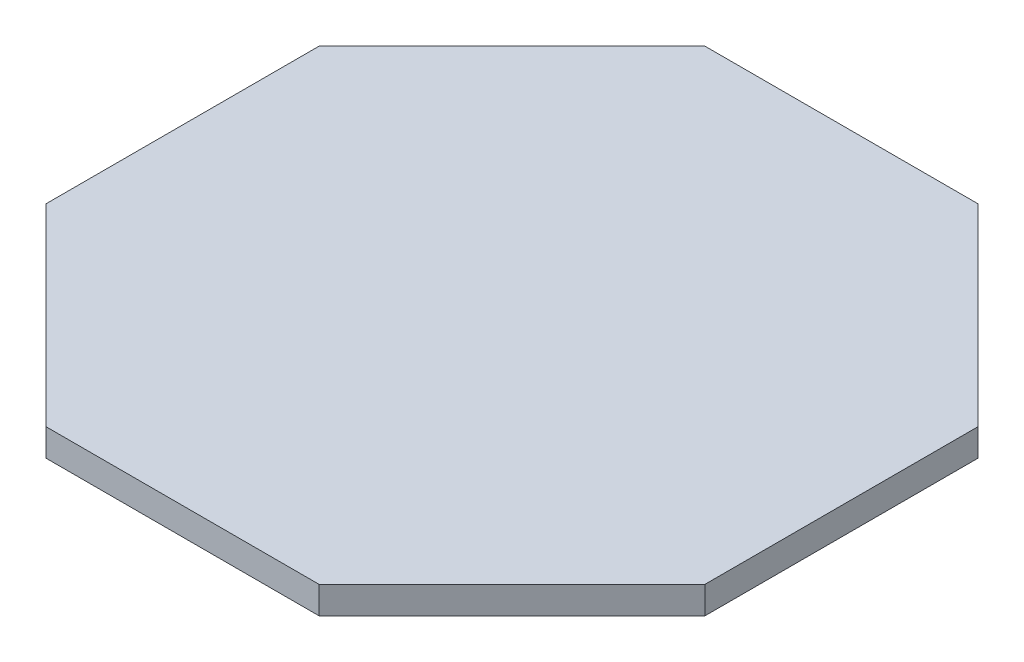
ISO-10303-21;
HEADER;
FILE_DESCRIPTION(('STEP AP214'),'2;1');
FILE_NAME('part.step','',(''),(''),'','','');
FILE_SCHEMA(('AUTOMOTIVE_DESIGN { 1 0 10303 214 1 1 1 1 }'));
ENDSEC;
DATA;
#1=APPLICATION_CONTEXT('core data for automotive mechanical design processes');
#2=APPLICATION_PROTOCOL_DEFINITION('international standard','automotive_design',2000,#1);
#3=PRODUCT_CONTEXT('',#1,'mechanical');
#4=PRODUCT('Part','Part','',(#3));
#5=PRODUCT_RELATED_PRODUCT_CATEGORY('part','',(#4));
#6=PRODUCT_DEFINITION_FORMATION('','',#4);
#7=PRODUCT_DEFINITION_CONTEXT('part definition',#1,'design');
#8=PRODUCT_DEFINITION('design','',#6,#7);
#9=PRODUCT_DEFINITION_SHAPE('','',#8);
#10=(LENGTH_UNIT() NAMED_UNIT(*) SI_UNIT(.MILLI.,.METRE.));
#11=(NAMED_UNIT(*) PLANE_ANGLE_UNIT() SI_UNIT($,.RADIAN.));
#12=(NAMED_UNIT(*) SI_UNIT($,.STERADIAN.) SOLID_ANGLE_UNIT());
#13=UNCERTAINTY_MEASURE_WITH_UNIT(LENGTH_MEASURE(1.E-05),#10,'distance_accuracy_value','');
#14=(GEOMETRIC_REPRESENTATION_CONTEXT(3) GLOBAL_UNCERTAINTY_ASSIGNED_CONTEXT((#13)) GLOBAL_UNIT_ASSIGNED_CONTEXT((#10,
#11,#12)) REPRESENTATION_CONTEXT('',''));
#15=CARTESIAN_POINT('',(0.,0.,0.));
#16=DIRECTION('',(0.,0.,1.));
#17=DIRECTION('',(1.,0.,0.));
#18=AXIS2_PLACEMENT_3D('',#15,#16,#17);
#19=CARTESIAN_POINT('',(24.142135623731,2.,9.99999999999999));
#20=DIRECTION('',(-1.,0.,0.));
#21=DIRECTION('',(0.,0.,1.));
#22=AXIS2_PLACEMENT_3D('',#19,#20,#21);
#23=PLANE('',#22);
#24=DIRECTION('',(0.,0.,-1.));
#25=VECTOR('',#24,1.);
#26=CARTESIAN_POINT('',(24.142135623731,0.,9.99999999999999));
#27=LINE('',#26,#25);
#28=CARTESIAN_POINT('',(24.142135623731,0.,9.99999999999999));
#29=VERTEX_POINT('',#28);
#30=CARTESIAN_POINT('',(24.142135623731,0.,-10.));
#31=VERTEX_POINT('',#30);
#32=EDGE_CURVE('E133',#29,#31,#27,.T.);
#33=ORIENTED_EDGE('',*,*,#32,.T.);
#34=DIRECTION('',(0.,-1.,0.));
#35=VECTOR('',#34,1.);
#36=CARTESIAN_POINT('',(24.142135623731,2.,-10.));
#37=LINE('',#36,#35);
#38=CARTESIAN_POINT('',(24.142135623731,2.,-10.));
#39=VERTEX_POINT('',#38);
#40=EDGE_CURVE('E11',#39,#31,#37,.T.);
#41=ORIENTED_EDGE('',*,*,#40,.F.);
#42=DIRECTION('',(0.,0.,-1.));
#43=VECTOR('',#42,1.);
#44=CARTESIAN_POINT('',(24.142135623731,2.,9.99999999999999));
#45=LINE('',#44,#43);
#46=CARTESIAN_POINT('',(24.142135623731,2.,9.99999999999999));
#47=VERTEX_POINT('',#46);
#48=EDGE_CURVE('E147',#47,#39,#45,.T.);
#49=ORIENTED_EDGE('',*,*,#48,.F.);
#50=DIRECTION('',(0.,-1.,0.));
#51=VECTOR('',#50,1.);
#52=CARTESIAN_POINT('',(24.142135623731,2.,9.99999999999999));
#53=LINE('',#52,#51);
#54=EDGE_CURVE('E129',#47,#29,#53,.T.);
#55=ORIENTED_EDGE('',*,*,#54,.T.);
#56=EDGE_LOOP('',(#33,#41,#49,#55));
#57=FACE_BOUND('',#56,.T.);
#58=ADVANCED_FACE('F37',(#57),#23,.F.);
#59=CARTESIAN_POINT('',(24.142135623731,2.,-10.));
#60=DIRECTION('',(-0.707106781186547,0.,0.707106781186548));
#61=DIRECTION('',(0.707106781186548,0.,0.707106781186547));
#62=AXIS2_PLACEMENT_3D('',#59,#60,#61);
#63=PLANE('',#62);
#64=DIRECTION('',(-0.707106781186548,0.,-0.707106781186547));
#65=VECTOR('',#64,1.);
#66=CARTESIAN_POINT('',(24.142135623731,0.,-10.));
#67=LINE('',#66,#65);
#68=CARTESIAN_POINT('',(10.,0.,-24.1421356237309));
#69=VERTEX_POINT('',#68);
#70=EDGE_CURVE('E136',#31,#69,#67,.T.);
#71=ORIENTED_EDGE('',*,*,#70,.T.);
#72=DIRECTION('',(0.,-1.,0.));
#73=VECTOR('',#72,1.);
#74=CARTESIAN_POINT('',(10.,2.,-24.1421356237309));
#75=LINE('',#74,#73);
#76=CARTESIAN_POINT('',(10.,2.,-24.1421356237309));
#77=VERTEX_POINT('',#76);
#78=EDGE_CURVE('E45',#77,#69,#75,.T.);
#79=ORIENTED_EDGE('',*,*,#78,.F.);
#80=DIRECTION('',(-0.707106781186548,0.,-0.707106781186547));
#81=VECTOR('',#80,1.);
#82=CARTESIAN_POINT('',(24.142135623731,2.,-10.));
#83=LINE('',#82,#81);
#84=EDGE_CURVE('E96',#39,#77,#83,.T.);
#85=ORIENTED_EDGE('',*,*,#84,.F.);
#86=ORIENTED_EDGE('',*,*,#40,.T.);
#87=EDGE_LOOP('',(#71,#79,#85,#86));
#88=FACE_BOUND('',#87,.T.);
#89=ADVANCED_FACE('F182',(#88),#63,.F.);
#90=CARTESIAN_POINT('',(10.,2.,-24.1421356237309));
#91=DIRECTION('',(0.,0.,1.));
#92=DIRECTION('',(1.,0.,0.));
#93=AXIS2_PLACEMENT_3D('',#90,#91,#92);
#94=PLANE('',#93);
#95=DIRECTION('',(-1.,0.,0.));
#96=VECTOR('',#95,1.);
#97=CARTESIAN_POINT('',(10.,0.,-24.1421356237309));
#98=LINE('',#97,#96);
#99=CARTESIAN_POINT('',(-10.,0.,-24.1421356237309));
#100=VERTEX_POINT('',#99);
#101=EDGE_CURVE('E138',#69,#100,#98,.T.);
#102=ORIENTED_EDGE('',*,*,#101,.T.);
#103=DIRECTION('',(0.,-1.,0.));
#104=VECTOR('',#103,1.);
#105=CARTESIAN_POINT('',(-10.,2.,-24.1421356237309));
#106=LINE('',#105,#104);
#107=CARTESIAN_POINT('',(-10.,2.,-24.1421356237309));
#108=VERTEX_POINT('',#107);
#109=EDGE_CURVE('E154',#108,#100,#106,.T.);
#110=ORIENTED_EDGE('',*,*,#109,.F.);
#111=DIRECTION('',(-1.,0.,0.));
#112=VECTOR('',#111,1.);
#113=CARTESIAN_POINT('',(10.,2.,-24.1421356237309));
#114=LINE('',#113,#112);
#115=EDGE_CURVE('E162',#77,#108,#114,.T.);
#116=ORIENTED_EDGE('',*,*,#115,.F.);
#117=ORIENTED_EDGE('',*,*,#78,.T.);
#118=EDGE_LOOP('',(#102,#110,#116,#117));
#119=FACE_BOUND('',#118,.T.);
#120=ADVANCED_FACE('F160',(#119),#94,.F.);
#121=CARTESIAN_POINT('',(-10.,2.,-24.1421356237309));
#122=DIRECTION('',(0.707106781186548,0.,0.707106781186547));
#123=DIRECTION('',(0.707106781186547,0.,-0.707106781186548));
#124=AXIS2_PLACEMENT_3D('',#121,#122,#123);
#125=PLANE('',#124);
#126=DIRECTION('',(-0.707106781186547,0.,0.707106781186548));
#127=VECTOR('',#126,1.);
#128=CARTESIAN_POINT('',(-10.,0.,-24.1421356237309));
#129=LINE('',#128,#127);
#130=CARTESIAN_POINT('',(-24.142135623731,0.,-9.99999999999999));
#131=VERTEX_POINT('',#130);
#132=EDGE_CURVE('E140',#100,#131,#129,.T.);
#133=ORIENTED_EDGE('',*,*,#132,.T.);
#134=DIRECTION('',(0.,-1.,0.));
#135=VECTOR('',#134,1.);
#136=CARTESIAN_POINT('',(-24.142135623731,2.,-9.99999999999999));
#137=LINE('',#136,#135);
#138=CARTESIAN_POINT('',(-24.142135623731,2.,-9.99999999999999));
#139=VERTEX_POINT('',#138);
#140=EDGE_CURVE('E151',#139,#131,#137,.T.);
#141=ORIENTED_EDGE('',*,*,#140,.F.);
#142=DIRECTION('',(-0.707106781186547,0.,0.707106781186548));
#143=VECTOR('',#142,1.);
#144=CARTESIAN_POINT('',(-10.,2.,-24.1421356237309));
#145=LINE('',#144,#143);
#146=EDGE_CURVE('E174',#108,#139,#145,.T.);
#147=ORIENTED_EDGE('',*,*,#146,.F.);
#148=ORIENTED_EDGE('',*,*,#109,.T.);
#149=EDGE_LOOP('',(#133,#141,#147,#148));
#150=FACE_BOUND('',#149,.T.);
#151=ADVANCED_FACE('F170',(#150),#125,.F.);
#152=CARTESIAN_POINT('',(-24.142135623731,2.,-9.99999999999999));
#153=DIRECTION('',(1.,0.,0.));
#154=DIRECTION('',(0.,0.,-1.));
#155=AXIS2_PLACEMENT_3D('',#152,#153,#154);
#156=PLANE('',#155);
#157=DIRECTION('',(0.,0.,1.));
#158=VECTOR('',#157,1.);
#159=CARTESIAN_POINT('',(-24.142135623731,0.,-9.99999999999999));
#160=LINE('',#159,#158);
#161=CARTESIAN_POINT('',(-24.1421356237309,0.,10.));
#162=VERTEX_POINT('',#161);
#163=EDGE_CURVE('E142',#131,#162,#160,.T.);
#164=ORIENTED_EDGE('',*,*,#163,.T.);
#165=DIRECTION('',(0.,-1.,0.));
#166=VECTOR('',#165,1.);
#167=CARTESIAN_POINT('',(-24.1421356237309,2.,10.));
#168=LINE('',#167,#166);
#169=CARTESIAN_POINT('',(-24.1421356237309,2.,10.));
#170=VERTEX_POINT('',#169);
#171=EDGE_CURVE('E124',#170,#162,#168,.T.);
#172=ORIENTED_EDGE('',*,*,#171,.F.);
#173=DIRECTION('',(0.,0.,1.));
#174=VECTOR('',#173,1.);
#175=CARTESIAN_POINT('',(-24.142135623731,2.,-9.99999999999999));
#176=LINE('',#175,#174);
#177=EDGE_CURVE('E115',#139,#170,#176,.T.);
#178=ORIENTED_EDGE('',*,*,#177,.F.);
#179=ORIENTED_EDGE('',*,*,#140,.T.);
#180=EDGE_LOOP('',(#164,#172,#178,#179));
#181=FACE_BOUND('',#180,.T.);
#182=ADVANCED_FACE('F173',(#181),#156,.F.);
#183=CARTESIAN_POINT('',(-24.1421356237309,2.,10.));
#184=DIRECTION('',(0.707106781186547,0.,-0.707106781186548));
#185=DIRECTION('',(-0.707106781186548,0.,-0.707106781186547));
#186=AXIS2_PLACEMENT_3D('',#183,#184,#185);
#187=PLANE('',#186);
#188=DIRECTION('',(0.707106781186548,0.,0.707106781186547));
#189=VECTOR('',#188,1.);
#190=CARTESIAN_POINT('',(-24.1421356237309,0.,10.));
#191=LINE('',#190,#189);
#192=CARTESIAN_POINT('',(-9.99999999999999,0.,24.142135623731));
#193=VERTEX_POINT('',#192);
#194=EDGE_CURVE('E123',#162,#193,#191,.T.);
#195=ORIENTED_EDGE('',*,*,#194,.T.);
#196=DIRECTION('',(0.,-1.,0.));
#197=VECTOR('',#196,1.);
#198=CARTESIAN_POINT('',(-9.99999999999999,2.,24.142135623731));
#199=LINE('',#198,#197);
#200=CARTESIAN_POINT('',(-9.99999999999999,2.,24.142135623731));
#201=VERTEX_POINT('',#200);
#202=EDGE_CURVE('E120',#201,#193,#199,.T.);
#203=ORIENTED_EDGE('',*,*,#202,.F.);
#204=DIRECTION('',(0.707106781186548,0.,0.707106781186547));
#205=VECTOR('',#204,1.);
#206=CARTESIAN_POINT('',(-24.1421356237309,2.,10.));
#207=LINE('',#206,#205);
#208=EDGE_CURVE('E109',#170,#201,#207,.T.);
#209=ORIENTED_EDGE('',*,*,#208,.F.);
#210=ORIENTED_EDGE('',*,*,#171,.T.);
#211=EDGE_LOOP('',(#195,#203,#209,#210));
#212=FACE_BOUND('',#211,.T.);
#213=ADVANCED_FACE('F121',(#212),#187,.F.);
#214=CARTESIAN_POINT('',(-9.99999999999999,2.,24.142135623731));
#215=DIRECTION('',(0.,0.,-1.));
#216=DIRECTION('',(-1.,0.,0.));
#217=AXIS2_PLACEMENT_3D('',#214,#215,#216);
#218=PLANE('',#217);
#219=DIRECTION('',(1.,0.,0.));
#220=VECTOR('',#219,1.);
#221=CARTESIAN_POINT('',(-9.99999999999999,0.,24.142135623731));
#222=LINE('',#221,#220);
#223=CARTESIAN_POINT('',(10.,0.,24.142135623731));
#224=VERTEX_POINT('',#223);
#225=EDGE_CURVE('E82',#193,#224,#222,.T.);
#226=ORIENTED_EDGE('',*,*,#225,.T.);
#227=DIRECTION('',(0.,-1.,0.));
#228=VECTOR('',#227,1.);
#229=CARTESIAN_POINT('',(10.,2.,24.142135623731));
#230=LINE('',#229,#228);
#231=CARTESIAN_POINT('',(10.,2.,24.142135623731));
#232=VERTEX_POINT('',#231);
#233=EDGE_CURVE('E125',#232,#224,#230,.T.);
#234=ORIENTED_EDGE('',*,*,#233,.F.);
#235=DIRECTION('',(1.,0.,0.));
#236=VECTOR('',#235,1.);
#237=CARTESIAN_POINT('',(-9.99999999999999,2.,24.142135623731));
#238=LINE('',#237,#236);
#239=EDGE_CURVE('E113',#201,#232,#238,.T.);
#240=ORIENTED_EDGE('',*,*,#239,.F.);
#241=ORIENTED_EDGE('',*,*,#202,.T.);
#242=EDGE_LOOP('',(#226,#234,#240,#241));
#243=FACE_BOUND('',#242,.T.);
#244=ADVANCED_FACE('F127',(#243),#218,.F.);
#245=CARTESIAN_POINT('',(10.,2.,24.142135623731));
#246=DIRECTION('',(-0.707106781186548,0.,-0.707106781186547));
#247=DIRECTION('',(-0.707106781186547,0.,0.707106781186548));
#248=AXIS2_PLACEMENT_3D('',#245,#246,#247);
#249=PLANE('',#248);
#250=DIRECTION('',(0.707106781186547,0.,-0.707106781186548));
#251=VECTOR('',#250,1.);
#252=CARTESIAN_POINT('',(10.,0.,24.142135623731));
#253=LINE('',#252,#251);
#254=EDGE_CURVE('E88',#224,#29,#253,.T.);
#255=ORIENTED_EDGE('',*,*,#254,.T.);
#256=ORIENTED_EDGE('',*,*,#54,.F.);
#257=DIRECTION('',(0.707106781186547,0.,-0.707106781186548));
#258=VECTOR('',#257,1.);
#259=CARTESIAN_POINT('',(10.,2.,24.142135623731));
#260=LINE('',#259,#258);
#261=EDGE_CURVE('E53',#232,#47,#260,.T.);
#262=ORIENTED_EDGE('',*,*,#261,.F.);
#263=ORIENTED_EDGE('',*,*,#233,.T.);
#264=EDGE_LOOP('',(#255,#256,#262,#263));
#265=FACE_BOUND('',#264,.T.);
#266=ADVANCED_FACE('F198',(#265),#249,.F.);
#267=CARTESIAN_POINT('',(0.,2.,0.));
#268=DIRECTION('',(0.,1.,0.));
#269=DIRECTION('',(0.,0.,1.));
#270=AXIS2_PLACEMENT_3D('',#267,#268,#269);
#271=PLANE('',#270);
#272=ORIENTED_EDGE('',*,*,#48,.T.);
#273=ORIENTED_EDGE('',*,*,#84,.T.);
#274=ORIENTED_EDGE('',*,*,#115,.T.);
#275=ORIENTED_EDGE('',*,*,#146,.T.);
#276=ORIENTED_EDGE('',*,*,#177,.T.);
#277=ORIENTED_EDGE('',*,*,#208,.T.);
#278=ORIENTED_EDGE('',*,*,#239,.T.);
#279=ORIENTED_EDGE('',*,*,#261,.T.);
#280=EDGE_LOOP('',(#272,#273,#274,#275,#276,#277,#278,#279));
#281=FACE_BOUND('',#280,.T.);
#282=ADVANCED_FACE('F111',(#281),#271,.T.);
#283=CARTESIAN_POINT('',(0.,0.,0.));
#284=DIRECTION('',(0.,1.,0.));
#285=DIRECTION('',(0.,0.,1.));
#286=AXIS2_PLACEMENT_3D('',#283,#284,#285);
#287=PLANE('',#286);
#288=ORIENTED_EDGE('',*,*,#32,.F.);
#289=ORIENTED_EDGE('',*,*,#254,.F.);
#290=ORIENTED_EDGE('',*,*,#225,.F.);
#291=ORIENTED_EDGE('',*,*,#194,.F.);
#292=ORIENTED_EDGE('',*,*,#163,.F.);
#293=ORIENTED_EDGE('',*,*,#132,.F.);
#294=ORIENTED_EDGE('',*,*,#101,.F.);
#295=ORIENTED_EDGE('',*,*,#70,.F.);
#296=EDGE_LOOP('',(#288,#289,#290,#291,#292,#293,#294,#295));
#297=FACE_BOUND('',#296,.T.);
#298=ADVANCED_FACE('F166',(#297),#287,.F.);
#299=CLOSED_SHELL('',(#58,#89,#120,#151,#182,#213,#244,#266,#282,#298));
#300=MANIFOLD_SOLID_BREP('B2',#299);
#301=ADVANCED_BREP_SHAPE_REPRESENTATION('',(#18,#300),#14);
#302=SHAPE_DEFINITION_REPRESENTATION(#9,#301);
ENDSEC;
END-ISO-10303-21;
